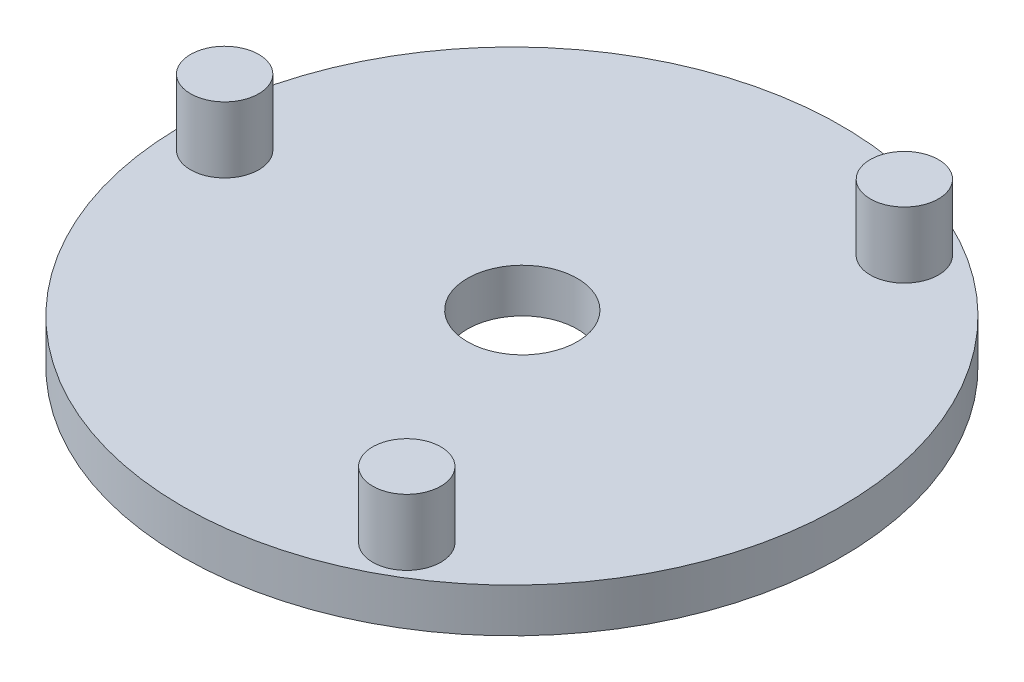
ISO-10303-21;
HEADER;
FILE_DESCRIPTION(('STEP AP214'),'2;1');
FILE_NAME('part.step','',(''),(''),'','','');
FILE_SCHEMA(('AUTOMOTIVE_DESIGN { 1 0 10303 214 1 1 1 1 }'));
ENDSEC;
DATA;
#1=APPLICATION_CONTEXT('core data for automotive mechanical design processes');
#2=APPLICATION_PROTOCOL_DEFINITION('international standard','automotive_design',2000,#1);
#3=PRODUCT_CONTEXT('',#1,'mechanical');
#4=PRODUCT('Part','Part','',(#3));
#5=PRODUCT_RELATED_PRODUCT_CATEGORY('part','',(#4));
#6=PRODUCT_DEFINITION_FORMATION('','',#4);
#7=PRODUCT_DEFINITION_CONTEXT('part definition',#1,'design');
#8=PRODUCT_DEFINITION('design','',#6,#7);
#9=PRODUCT_DEFINITION_SHAPE('','',#8);
#10=(LENGTH_UNIT() NAMED_UNIT(*) SI_UNIT(.MILLI.,.METRE.));
#11=(NAMED_UNIT(*) PLANE_ANGLE_UNIT() SI_UNIT($,.RADIAN.));
#12=(NAMED_UNIT(*) SI_UNIT($,.STERADIAN.) SOLID_ANGLE_UNIT());
#13=UNCERTAINTY_MEASURE_WITH_UNIT(LENGTH_MEASURE(1.E-05),#10,'distance_accuracy_value','');
#14=(GEOMETRIC_REPRESENTATION_CONTEXT(3) GLOBAL_UNCERTAINTY_ASSIGNED_CONTEXT((#13)) GLOBAL_UNIT_ASSIGNED_CONTEXT((#10,
#11,#12)) REPRESENTATION_CONTEXT('',''));
#15=CARTESIAN_POINT('',(0.,0.,0.));
#16=DIRECTION('',(0.,0.,1.));
#17=DIRECTION('',(1.,0.,0.));
#18=AXIS2_PLACEMENT_3D('',#15,#16,#17);
#19=CARTESIAN_POINT('',(0.,20.,0.));
#20=DIRECTION('',(0.,1.,0.));
#21=DIRECTION('',(0.,0.,1.));
#22=AXIS2_PLACEMENT_3D('',#19,#20,#21);
#23=PLANE('',#22);
#24=CARTESIAN_POINT('',(65.3766069865016,20.,113.235604927086));
#25=DIRECTION('',(0.,1.,0.));
#26=DIRECTION('',(0.,0.,1.));
#27=AXIS2_PLACEMENT_3D('',#24,#25,#26);
#28=CIRCLE('',#27,15.5176792457656);
#29=CARTESIAN_POINT('',(65.3766069865016,20.,128.753284172851));
#30=VERTEX_POINT('',#29);
#31=EDGE_CURVE('E76',#30,#30,#28,.T.);
#32=ORIENTED_EDGE('',*,*,#31,.F.);
#33=EDGE_LOOP('',(#32));
#34=FACE_BOUND('',#33,.T.);
#35=CARTESIAN_POINT('',(65.3766069865032,20.,-113.235604927085));
#36=DIRECTION('',(0.,1.,0.));
#37=DIRECTION('',(0.,0.,1.));
#38=AXIS2_PLACEMENT_3D('',#35,#36,#37);
#39=CIRCLE('',#38,15.5176792457656);
#40=CARTESIAN_POINT('',(65.3766069865032,20.,-97.7179256813192));
#41=VERTEX_POINT('',#40);
#42=EDGE_CURVE('E70',#41,#41,#39,.T.);
#43=ORIENTED_EDGE('',*,*,#42,.F.);
#44=EDGE_LOOP('',(#43));
#45=FACE_BOUND('',#44,.T.);
#46=CARTESIAN_POINT('',(-130.753213973005,20.,0.));
#47=DIRECTION('',(0.,1.,0.));
#48=DIRECTION('',(0.,0.,1.));
#49=AXIS2_PLACEMENT_3D('',#46,#47,#48);
#50=CIRCLE('',#49,15.5176792457656);
#51=CARTESIAN_POINT('',(-130.753213973005,20.,15.5176792457656));
#52=VERTEX_POINT('',#51);
#53=EDGE_CURVE('E64',#52,#52,#50,.T.);
#54=ORIENTED_EDGE('',*,*,#53,.F.);
#55=EDGE_LOOP('',(#54));
#56=FACE_BOUND('',#55,.T.);
#57=CARTESIAN_POINT('',(0.,20.,0.));
#58=DIRECTION('',(0.,1.,0.));
#59=DIRECTION('',(0.,0.,1.));
#60=AXIS2_PLACEMENT_3D('',#57,#58,#59);
#61=CIRCLE('',#60,150.);
#62=CARTESIAN_POINT('',(0.,20.,150.));
#63=VERTEX_POINT('',#62);
#64=EDGE_CURVE('E51',#63,#63,#61,.T.);
#65=ORIENTED_EDGE('',*,*,#64,.T.);
#66=EDGE_LOOP('',(#65));
#67=FACE_BOUND('',#66,.T.);
#68=CARTESIAN_POINT('',(0.,20.,-4.72419459347687));
#69=DIRECTION('',(0.,1.,0.));
#70=DIRECTION('',(0.,0.,1.));
#71=AXIS2_PLACEMENT_3D('',#68,#69,#70);
#72=CIRCLE('',#71,25.);
#73=CARTESIAN_POINT('',(0.,20.,20.2758054065231));
#74=VERTEX_POINT('',#73);
#75=EDGE_CURVE('E55',#74,#74,#72,.T.);
#76=ORIENTED_EDGE('',*,*,#75,.F.);
#77=EDGE_LOOP('',(#76));
#78=FACE_BOUND('',#77,.T.);
#79=ADVANCED_FACE('F31',(#34,#45,#56,#67,#78),#23,.T.);
#80=CARTESIAN_POINT('',(0.,0.,0.));
#81=DIRECTION('',(0.,1.,0.));
#82=DIRECTION('',(0.,0.,1.));
#83=AXIS2_PLACEMENT_3D('',#80,#81,#82);
#84=PLANE('',#83);
#85=CARTESIAN_POINT('',(-22.8544309709261,0.,-103.006882489733));
#86=DIRECTION('',(0.,1.,0.));
#87=DIRECTION('',(0.,0.,1.));
#88=AXIS2_PLACEMENT_3D('',#85,#86,#87);
#89=CIRCLE('',#88,15.0120967230542);
#90=CARTESIAN_POINT('',(-22.8544309709261,0.,-87.9947857666792));
#91=VERTEX_POINT('',#90);
#92=EDGE_CURVE('E10',#91,#91,#89,.F.);
#93=ORIENTED_EDGE('',*,*,#92,.F.);
#94=EDGE_LOOP('',(#93));
#95=FACE_BOUND('',#94,.T.);
#96=CARTESIAN_POINT('',(103.006882489737,0.,-22.8544309709239));
#97=DIRECTION('',(0.,1.,0.));
#98=DIRECTION('',(0.,0.,1.));
#99=AXIS2_PLACEMENT_3D('',#96,#97,#98);
#100=CIRCLE('',#99,15.012096723058);
#101=CARTESIAN_POINT('',(103.006882489737,0.,-7.84233424786591));
#102=VERTEX_POINT('',#101);
#103=EDGE_CURVE('E38',#102,#102,#100,.F.);
#104=ORIENTED_EDGE('',*,*,#103,.F.);
#105=EDGE_LOOP('',(#104));
#106=FACE_BOUND('',#105,.T.);
#107=CARTESIAN_POINT('',(22.8544309709274,0.,103.006882489739));
#108=DIRECTION('',(0.,1.,0.));
#109=DIRECTION('',(0.,0.,1.));
#110=AXIS2_PLACEMENT_3D('',#107,#108,#109);
#111=CIRCLE('',#110,15.0120967230589);
#112=CARTESIAN_POINT('',(22.8544309709274,0.,118.018979212798));
#113=VERTEX_POINT('',#112);
#114=EDGE_CURVE('E42',#113,#113,#111,.F.);
#115=ORIENTED_EDGE('',*,*,#114,.F.);
#116=EDGE_LOOP('',(#115));
#117=FACE_BOUND('',#116,.T.);
#118=CARTESIAN_POINT('',(-103.006882489736,0.,22.8544309709297));
#119=DIRECTION('',(0.,1.,0.));
#120=DIRECTION('',(0.,0.,1.));
#121=AXIS2_PLACEMENT_3D('',#118,#119,#120);
#122=CIRCLE('',#121,15.0120967230547);
#123=CARTESIAN_POINT('',(-103.006882489736,0.,37.8665276939844));
#124=VERTEX_POINT('',#123);
#125=EDGE_CURVE('E46',#124,#124,#122,.F.);
#126=ORIENTED_EDGE('',*,*,#125,.F.);
#127=EDGE_LOOP('',(#126));
#128=FACE_BOUND('',#127,.T.);
#129=CARTESIAN_POINT('',(0.,0.,0.));
#130=DIRECTION('',(0.,1.,0.));
#131=DIRECTION('',(0.,0.,1.));
#132=AXIS2_PLACEMENT_3D('',#129,#130,#131);
#133=CIRCLE('',#132,150.);
#134=CARTESIAN_POINT('',(0.,0.,150.));
#135=VERTEX_POINT('',#134);
#136=EDGE_CURVE('E52',#135,#135,#133,.T.);
#137=ORIENTED_EDGE('',*,*,#136,.F.);
#138=EDGE_LOOP('',(#137));
#139=FACE_BOUND('',#138,.T.);
#140=CARTESIAN_POINT('',(0.,0.,-4.72419459347687));
#141=DIRECTION('',(0.,1.,0.));
#142=DIRECTION('',(0.,0.,1.));
#143=AXIS2_PLACEMENT_3D('',#140,#141,#142);
#144=CIRCLE('',#143,25.);
#145=CARTESIAN_POINT('',(0.,0.,20.2758054065231));
#146=VERTEX_POINT('',#145);
#147=EDGE_CURVE('E58',#146,#146,#144,.T.);
#148=ORIENTED_EDGE('',*,*,#147,.T.);
#149=EDGE_LOOP('',(#148));
#150=FACE_BOUND('',#149,.T.);
#151=ADVANCED_FACE('F109',(#95,#106,#117,#128,#139,#150),#84,.F.);
#152=CARTESIAN_POINT('',(0.,20.,0.));
#153=DIRECTION('',(0.,-1.,0.));
#154=DIRECTION('',(0.,0.,-1.));
#155=AXIS2_PLACEMENT_3D('',#152,#153,#154);
#156=CYLINDRICAL_SURFACE('',#155,150.);
#157=ORIENTED_EDGE('',*,*,#64,.F.);
#158=EDGE_LOOP('',(#157));
#159=FACE_BOUND('',#158,.T.);
#160=ORIENTED_EDGE('',*,*,#136,.T.);
#161=EDGE_LOOP('',(#160));
#162=FACE_BOUND('',#161,.T.);
#163=ADVANCED_FACE('F33',(#159,#162),#156,.T.);
#164=CARTESIAN_POINT('',(0.,20.,-4.72419459347687));
#165=DIRECTION('',(0.,-1.,0.));
#166=DIRECTION('',(0.,0.,-1.));
#167=AXIS2_PLACEMENT_3D('',#164,#165,#166);
#168=CYLINDRICAL_SURFACE('',#167,25.);
#169=ORIENTED_EDGE('',*,*,#75,.T.);
#170=EDGE_LOOP('',(#169));
#171=FACE_BOUND('',#170,.T.);
#172=ORIENTED_EDGE('',*,*,#147,.F.);
#173=EDGE_LOOP('',(#172));
#174=FACE_BOUND('',#173,.T.);
#175=ADVANCED_FACE('F119',(#171,#174),#168,.F.);
#176=CARTESIAN_POINT('',(-130.753213973005,50.,0.));
#177=DIRECTION('',(0.,-1.,0.));
#178=DIRECTION('',(0.,0.,-1.));
#179=AXIS2_PLACEMENT_3D('',#176,#177,#178);
#180=CYLINDRICAL_SURFACE('',#179,15.5176792457656);
#181=CARTESIAN_POINT('',(-130.753213973005,50.,0.));
#182=DIRECTION('',(0.,1.,0.));
#183=DIRECTION('',(0.,0.,1.));
#184=AXIS2_PLACEMENT_3D('',#181,#182,#183);
#185=CIRCLE('',#184,15.5176792457656);
#186=CARTESIAN_POINT('',(-130.753213973005,50.,15.5176792457656));
#187=VERTEX_POINT('',#186);
#188=EDGE_CURVE('E61',#187,#187,#185,.T.);
#189=ORIENTED_EDGE('',*,*,#188,.F.);
#190=EDGE_LOOP('',(#189));
#191=FACE_BOUND('',#190,.T.);
#192=ORIENTED_EDGE('',*,*,#53,.T.);
#193=EDGE_LOOP('',(#192));
#194=FACE_BOUND('',#193,.T.);
#195=ADVANCED_FACE('F122',(#191,#194),#180,.T.);
#196=CARTESIAN_POINT('',(-130.753213973005,50.,0.));
#197=DIRECTION('',(0.,1.,0.));
#198=DIRECTION('',(0.,0.,1.));
#199=AXIS2_PLACEMENT_3D('',#196,#197,#198);
#200=PLANE('',#199);
#201=ORIENTED_EDGE('',*,*,#188,.T.);
#202=EDGE_LOOP('',(#201));
#203=FACE_BOUND('',#202,.T.);
#204=ADVANCED_FACE('F126',(#203),#200,.T.);
#205=CARTESIAN_POINT('',(65.3766069865032,50.,-113.235604927085));
#206=DIRECTION('',(0.,-1.,0.));
#207=DIRECTION('',(0.,0.,-1.));
#208=AXIS2_PLACEMENT_3D('',#205,#206,#207);
#209=CYLINDRICAL_SURFACE('',#208,15.5176792457656);
#210=CARTESIAN_POINT('',(65.3766069865032,50.,-113.235604927085));
#211=DIRECTION('',(0.,1.,0.));
#212=DIRECTION('',(0.,0.,1.));
#213=AXIS2_PLACEMENT_3D('',#210,#211,#212);
#214=CIRCLE('',#213,15.5176792457656);
#215=CARTESIAN_POINT('',(65.3766069865032,50.,-97.7179256813192));
#216=VERTEX_POINT('',#215);
#217=EDGE_CURVE('E67',#216,#216,#214,.T.);
#218=ORIENTED_EDGE('',*,*,#217,.F.);
#219=EDGE_LOOP('',(#218));
#220=FACE_BOUND('',#219,.T.);
#221=ORIENTED_EDGE('',*,*,#42,.T.);
#222=EDGE_LOOP('',(#221));
#223=FACE_BOUND('',#222,.T.);
#224=ADVANCED_FACE('F130',(#220,#223),#209,.T.);
#225=CARTESIAN_POINT('',(65.3766069865032,50.,-113.235604927085));
#226=DIRECTION('',(0.,1.,0.));
#227=DIRECTION('',(0.,0.,1.));
#228=AXIS2_PLACEMENT_3D('',#225,#226,#227);
#229=PLANE('',#228);
#230=ORIENTED_EDGE('',*,*,#217,.T.);
#231=EDGE_LOOP('',(#230));
#232=FACE_BOUND('',#231,.T.);
#233=ADVANCED_FACE('F134',(#232),#229,.T.);
#234=CARTESIAN_POINT('',(65.3766069865016,50.,113.235604927086));
#235=DIRECTION('',(0.,-1.,0.));
#236=DIRECTION('',(0.,0.,-1.));
#237=AXIS2_PLACEMENT_3D('',#234,#235,#236);
#238=CYLINDRICAL_SURFACE('',#237,15.5176792457656);
#239=CARTESIAN_POINT('',(65.3766069865016,50.,113.235604927086));
#240=DIRECTION('',(0.,1.,0.));
#241=DIRECTION('',(0.,0.,1.));
#242=AXIS2_PLACEMENT_3D('',#239,#240,#241);
#243=CIRCLE('',#242,15.5176792457656);
#244=CARTESIAN_POINT('',(65.3766069865016,50.,128.753284172851));
#245=VERTEX_POINT('',#244);
#246=EDGE_CURVE('E73',#245,#245,#243,.T.);
#247=ORIENTED_EDGE('',*,*,#246,.F.);
#248=EDGE_LOOP('',(#247));
#249=FACE_BOUND('',#248,.T.);
#250=ORIENTED_EDGE('',*,*,#31,.T.);
#251=EDGE_LOOP('',(#250));
#252=FACE_BOUND('',#251,.T.);
#253=ADVANCED_FACE('F138',(#249,#252),#238,.T.);
#254=CARTESIAN_POINT('',(65.3766069865016,50.,113.235604927086));
#255=DIRECTION('',(0.,1.,0.));
#256=DIRECTION('',(0.,0.,1.));
#257=AXIS2_PLACEMENT_3D('',#254,#255,#256);
#258=PLANE('',#257);
#259=ORIENTED_EDGE('',*,*,#246,.T.);
#260=EDGE_LOOP('',(#259));
#261=FACE_BOUND('',#260,.T.);
#262=ADVANCED_FACE('F142',(#261),#258,.T.);
#263=CARTESIAN_POINT('',(-103.006882489736,-20.,22.8544309709297));
#264=DIRECTION('',(0.,1.,0.));
#265=DIRECTION('',(0.,0.,1.));
#266=AXIS2_PLACEMENT_3D('',#263,#264,#265);
#267=CYLINDRICAL_SURFACE('',#266,15.0120967230547);
#268=CARTESIAN_POINT('',(-103.006882489736,-20.,22.8544309709297));
#269=DIRECTION('',(0.,-1.,0.));
#270=DIRECTION('',(0.,0.,-1.));
#271=AXIS2_PLACEMENT_3D('',#268,#269,#270);
#272=CIRCLE('',#271,15.0120967230547);
#273=CARTESIAN_POINT('',(-103.006882489736,-20.,7.84233424787496));
#274=VERTEX_POINT('',#273);
#275=EDGE_CURVE('E79',#274,#274,#272,.T.);
#276=ORIENTED_EDGE('',*,*,#275,.F.);
#277=EDGE_LOOP('',(#276));
#278=FACE_BOUND('',#277,.T.);
#279=ORIENTED_EDGE('',*,*,#125,.T.);
#280=EDGE_LOOP('',(#279));
#281=FACE_BOUND('',#280,.T.);
#282=ADVANCED_FACE('F146',(#278,#281),#267,.T.);
#283=CARTESIAN_POINT('',(-103.006882489736,-20.,22.8544309709297));
#284=DIRECTION('',(0.,-1.,0.));
#285=DIRECTION('',(0.,0.,-1.));
#286=AXIS2_PLACEMENT_3D('',#283,#284,#285);
#287=PLANE('',#286);
#288=ORIENTED_EDGE('',*,*,#275,.T.);
#289=EDGE_LOOP('',(#288));
#290=FACE_BOUND('',#289,.T.);
#291=ADVANCED_FACE('F150',(#290),#287,.T.);
#292=CARTESIAN_POINT('',(22.8544309709274,-20.,103.006882489739));
#293=DIRECTION('',(0.,1.,0.));
#294=DIRECTION('',(0.,0.,1.));
#295=AXIS2_PLACEMENT_3D('',#292,#293,#294);
#296=CYLINDRICAL_SURFACE('',#295,15.0120967230589);
#297=CARTESIAN_POINT('',(22.8544309709274,-20.,103.006882489739));
#298=DIRECTION('',(0.,-1.,0.));
#299=DIRECTION('',(0.,0.,-1.));
#300=AXIS2_PLACEMENT_3D('',#297,#298,#299);
#301=CIRCLE('',#300,15.0120967230589);
#302=CARTESIAN_POINT('',(22.8544309709274,-20.,87.9947857666802));
#303=VERTEX_POINT('',#302);
#304=EDGE_CURVE('E84',#303,#303,#301,.T.);
#305=ORIENTED_EDGE('',*,*,#304,.F.);
#306=EDGE_LOOP('',(#305));
#307=FACE_BOUND('',#306,.T.);
#308=ORIENTED_EDGE('',*,*,#114,.T.);
#309=EDGE_LOOP('',(#308));
#310=FACE_BOUND('',#309,.T.);
#311=ADVANCED_FACE('F154',(#307,#310),#296,.T.);
#312=CARTESIAN_POINT('',(22.8544309709274,-20.,103.006882489739));
#313=DIRECTION('',(0.,-1.,0.));
#314=DIRECTION('',(0.,0.,-1.));
#315=AXIS2_PLACEMENT_3D('',#312,#313,#314);
#316=PLANE('',#315);
#317=ORIENTED_EDGE('',*,*,#304,.T.);
#318=EDGE_LOOP('',(#317));
#319=FACE_BOUND('',#318,.T.);
#320=ADVANCED_FACE('F158',(#319),#316,.T.);
#321=CARTESIAN_POINT('',(103.006882489737,-20.,-22.8544309709239));
#322=DIRECTION('',(0.,1.,0.));
#323=DIRECTION('',(0.,0.,1.));
#324=AXIS2_PLACEMENT_3D('',#321,#322,#323);
#325=CYLINDRICAL_SURFACE('',#324,15.012096723058);
#326=CARTESIAN_POINT('',(103.006882489737,-20.,-22.8544309709239));
#327=DIRECTION('',(0.,-1.,0.));
#328=DIRECTION('',(0.,0.,-1.));
#329=AXIS2_PLACEMENT_3D('',#326,#327,#328);
#330=CIRCLE('',#329,15.012096723058);
#331=CARTESIAN_POINT('',(103.006882489737,-20.,-37.8665276939819));
#332=VERTEX_POINT('',#331);
#333=EDGE_CURVE('E87',#332,#332,#330,.T.);
#334=ORIENTED_EDGE('',*,*,#333,.F.);
#335=EDGE_LOOP('',(#334));
#336=FACE_BOUND('',#335,.T.);
#337=ORIENTED_EDGE('',*,*,#103,.T.);
#338=EDGE_LOOP('',(#337));
#339=FACE_BOUND('',#338,.T.);
#340=ADVANCED_FACE('F105',(#336,#339),#325,.T.);
#341=CARTESIAN_POINT('',(103.006882489737,-20.,-22.8544309709239));
#342=DIRECTION('',(0.,-1.,0.));
#343=DIRECTION('',(0.,0.,-1.));
#344=AXIS2_PLACEMENT_3D('',#341,#342,#343);
#345=PLANE('',#344);
#346=ORIENTED_EDGE('',*,*,#333,.T.);
#347=EDGE_LOOP('',(#346));
#348=FACE_BOUND('',#347,.T.);
#349=ADVANCED_FACE('F98',(#348),#345,.T.);
#350=CARTESIAN_POINT('',(-22.8544309709261,-20.,-103.006882489733));
#351=DIRECTION('',(0.,1.,0.));
#352=DIRECTION('',(0.,0.,1.));
#353=AXIS2_PLACEMENT_3D('',#350,#351,#352);
#354=CYLINDRICAL_SURFACE('',#353,15.0120967230542);
#355=CARTESIAN_POINT('',(-22.8544309709261,-20.,-103.006882489733));
#356=DIRECTION('',(0.,-1.,0.));
#357=DIRECTION('',(0.,0.,-1.));
#358=AXIS2_PLACEMENT_3D('',#355,#356,#357);
#359=CIRCLE('',#358,15.0120967230542);
#360=CARTESIAN_POINT('',(-22.8544309709261,-20.,-118.018979212787));
#361=VERTEX_POINT('',#360);
#362=EDGE_CURVE('E90',#361,#361,#359,.T.);
#363=ORIENTED_EDGE('',*,*,#362,.F.);
#364=EDGE_LOOP('',(#363));
#365=FACE_BOUND('',#364,.T.);
#366=ORIENTED_EDGE('',*,*,#92,.T.);
#367=EDGE_LOOP('',(#366));
#368=FACE_BOUND('',#367,.T.);
#369=ADVANCED_FACE('F96',(#365,#368),#354,.T.);
#370=CARTESIAN_POINT('',(-22.8544309709261,-20.,-103.006882489733));
#371=DIRECTION('',(0.,-1.,0.));
#372=DIRECTION('',(0.,0.,-1.));
#373=AXIS2_PLACEMENT_3D('',#370,#371,#372);
#374=PLANE('',#373);
#375=ORIENTED_EDGE('',*,*,#362,.T.);
#376=EDGE_LOOP('',(#375));
#377=FACE_BOUND('',#376,.T.);
#378=ADVANCED_FACE('F94',(#377),#374,.T.);
#379=CLOSED_SHELL('',(#79,#151,#163,#175,#195,#204,#224,#233,#253,#262,#282,#291,#311,#320,#340,
#349,#369,#378));
#380=MANIFOLD_SOLID_BREP('B2',#379);
#381=ADVANCED_BREP_SHAPE_REPRESENTATION('',(#18,#380),#14);
#382=SHAPE_DEFINITION_REPRESENTATION(#9,#381);
ENDSEC;
END-ISO-10303-21;
